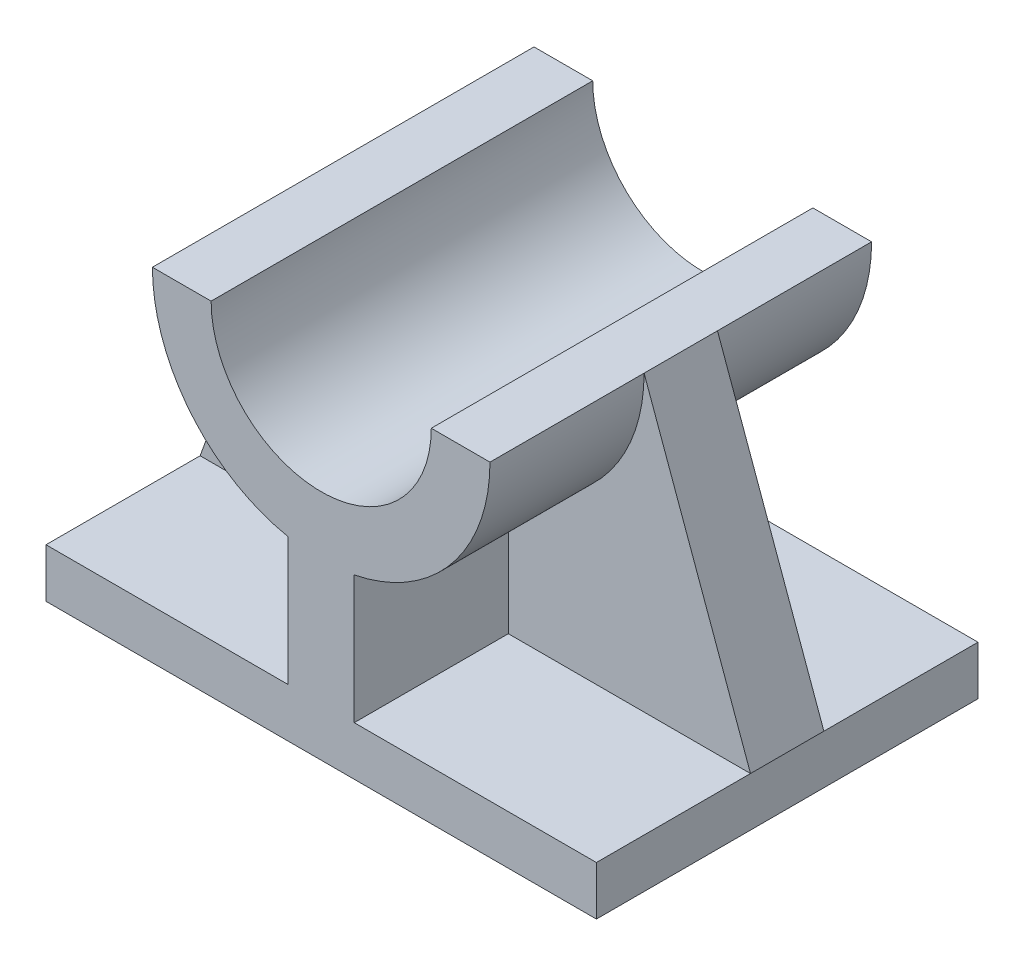
ISO-10303-21;
HEADER;
FILE_DESCRIPTION(('STEP AP214'),'2;1');
FILE_NAME('part.step','',(''),(''),'','','');
FILE_SCHEMA(('AUTOMOTIVE_DESIGN { 1 0 10303 214 1 1 1 1 }'));
ENDSEC;
DATA;
#1=APPLICATION_CONTEXT('core data for automotive mechanical design processes');
#2=APPLICATION_PROTOCOL_DEFINITION('international standard','automotive_design',2000,#1);
#3=PRODUCT_CONTEXT('',#1,'mechanical');
#4=PRODUCT('Part','Part','',(#3));
#5=PRODUCT_RELATED_PRODUCT_CATEGORY('part','',(#4));
#6=PRODUCT_DEFINITION_FORMATION('','',#4);
#7=PRODUCT_DEFINITION_CONTEXT('part definition',#1,'design');
#8=PRODUCT_DEFINITION('design','',#6,#7);
#9=PRODUCT_DEFINITION_SHAPE('','',#8);
#10=(LENGTH_UNIT() NAMED_UNIT(*) SI_UNIT(.MILLI.,.METRE.));
#11=(NAMED_UNIT(*) PLANE_ANGLE_UNIT() SI_UNIT($,.RADIAN.));
#12=(NAMED_UNIT(*) SI_UNIT($,.STERADIAN.) SOLID_ANGLE_UNIT());
#13=UNCERTAINTY_MEASURE_WITH_UNIT(LENGTH_MEASURE(1.E-05),#10,'distance_accuracy_value','');
#14=(GEOMETRIC_REPRESENTATION_CONTEXT(3) GLOBAL_UNCERTAINTY_ASSIGNED_CONTEXT((#13)) GLOBAL_UNIT_ASSIGNED_CONTEXT((#10,
#11,#12)) REPRESENTATION_CONTEXT('',''));
#15=CARTESIAN_POINT('',(0.,0.,0.));
#16=DIRECTION('',(0.,0.,1.));
#17=DIRECTION('',(1.,0.,0.));
#18=AXIS2_PLACEMENT_3D('',#15,#16,#17);
#19=CARTESIAN_POINT('',(37.5,46.6785714285714,26.));
#20=DIRECTION('',(0.,0.,-1.));
#21=DIRECTION('',(-1.,0.,0.));
#22=AXIS2_PLACEMENT_3D('',#19,#20,#21);
#23=CYLINDRICAL_SURFACE('',#22,23.);
#24=CARTESIAN_POINT('',(37.5,46.6785714285714,-5.));
#25=DIRECTION('',(0.,0.,1.));
#26=DIRECTION('',(1.,0.,0.));
#27=AXIS2_PLACEMENT_3D('',#24,#25,#26);
#28=CIRCLE('',#27,23.);
#29=CARTESIAN_POINT('',(14.5,46.6785714285714,-5.));
#30=VERTEX_POINT('',#29);
#31=CARTESIAN_POINT('',(33.,24.1230842912915,-5.));
#32=VERTEX_POINT('',#31);
#33=EDGE_CURVE('E472',#30,#32,#28,.T.);
#34=ORIENTED_EDGE('',*,*,#33,.F.);
#35=DIRECTION('',(0.,0.,-1.));
#36=VECTOR('',#35,1.);
#37=CARTESIAN_POINT('',(14.5,46.6785714285714,26.));
#38=LINE('',#37,#36);
#39=CARTESIAN_POINT('',(14.5,46.6785714285714,-26.));
#40=VERTEX_POINT('',#39);
#41=EDGE_CURVE('E206',#30,#40,#38,.T.);
#42=ORIENTED_EDGE('',*,*,#41,.T.);
#43=CARTESIAN_POINT('',(37.5,46.6785714285714,-26.));
#44=DIRECTION('',(0.,0.,1.));
#45=DIRECTION('',(1.,0.,0.));
#46=AXIS2_PLACEMENT_3D('',#43,#44,#45);
#47=CIRCLE('',#46,23.);
#48=CARTESIAN_POINT('',(33.,24.1230842912915,-26.));
#49=VERTEX_POINT('',#48);
#50=EDGE_CURVE('E272',#40,#49,#47,.T.);
#51=ORIENTED_EDGE('',*,*,#50,.T.);
#52=DIRECTION('',(0.,0.,-1.));
#53=VECTOR('',#52,1.);
#54=CARTESIAN_POINT('',(33.,24.1230842912915,26.));
#55=LINE('',#54,#53);
#56=EDGE_CURVE('E325',#32,#49,#55,.T.);
#57=ORIENTED_EDGE('',*,*,#56,.F.);
#58=EDGE_LOOP('',(#34,#42,#51,#57));
#59=FACE_BOUND('',#58,.T.);
#60=ADVANCED_FACE('F36',(#59),#23,.T.);
#61=CARTESIAN_POINT('',(33.,0.,26.));
#62=DIRECTION('',(-1.,0.,0.));
#63=DIRECTION('',(0.,0.,1.));
#64=AXIS2_PLACEMENT_3D('',#61,#62,#63);
#65=PLANE('',#64);
#66=DIRECTION('',(0.,0.,-1.));
#67=VECTOR('',#66,1.);
#68=CARTESIAN_POINT('',(33.,6.67857142857143,26.));
#69=LINE('',#68,#67);
#70=CARTESIAN_POINT('',(33.,6.67857142857143,-5.));
#71=VERTEX_POINT('',#70);
#72=CARTESIAN_POINT('',(33.,6.67857142857143,-26.));
#73=VERTEX_POINT('',#72);
#74=EDGE_CURVE('E321',#71,#73,#69,.T.);
#75=ORIENTED_EDGE('',*,*,#74,.F.);
#76=DIRECTION('',(0.,1.,0.));
#77=VECTOR('',#76,1.);
#78=CARTESIAN_POINT('',(33.,0.,-5.));
#79=LINE('',#78,#77);
#80=EDGE_CURVE('E196',#71,#32,#79,.T.);
#81=ORIENTED_EDGE('',*,*,#80,.T.);
#82=ORIENTED_EDGE('',*,*,#56,.T.);
#83=DIRECTION('',(0.,1.,0.));
#84=VECTOR('',#83,1.);
#85=CARTESIAN_POINT('',(33.,0.,-26.));
#86=LINE('',#85,#84);
#87=EDGE_CURVE('E276',#73,#49,#86,.T.);
#88=ORIENTED_EDGE('',*,*,#87,.F.);
#89=EDGE_LOOP('',(#75,#81,#82,#88));
#90=FACE_BOUND('',#89,.T.);
#91=ADVANCED_FACE('F340',(#90),#65,.T.);
#92=CARTESIAN_POINT('',(0.,6.67857142857143,26.));
#93=DIRECTION('',(0.,1.,0.));
#94=DIRECTION('',(0.,0.,1.));
#95=AXIS2_PLACEMENT_3D('',#92,#93,#94);
#96=PLANE('',#95);
#97=DIRECTION('',(0.,0.,-1.));
#98=VECTOR('',#97,1.);
#99=CARTESIAN_POINT('',(0.,6.67857142857143,26.));
#100=LINE('',#99,#98);
#101=CARTESIAN_POINT('',(0.,6.67857142857143,-4.99999999999999));
#102=VERTEX_POINT('',#101);
#103=CARTESIAN_POINT('',(0.,6.67857142857143,-26.));
#104=VERTEX_POINT('',#103);
#105=EDGE_CURVE('E317',#102,#104,#100,.T.);
#106=ORIENTED_EDGE('',*,*,#105,.F.);
#107=DIRECTION('',(1.,0.,0.));
#108=VECTOR('',#107,1.);
#109=CARTESIAN_POINT('',(0.,6.67857142857143,-5.));
#110=LINE('',#109,#108);
#111=EDGE_CURVE('E52',#102,#71,#110,.T.);
#112=ORIENTED_EDGE('',*,*,#111,.T.);
#113=ORIENTED_EDGE('',*,*,#74,.T.);
#114=DIRECTION('',(1.,0.,0.));
#115=VECTOR('',#114,1.);
#116=CARTESIAN_POINT('',(0.,6.67857142857143,-26.));
#117=LINE('',#116,#115);
#118=EDGE_CURVE('E280',#104,#73,#117,.T.);
#119=ORIENTED_EDGE('',*,*,#118,.F.);
#120=EDGE_LOOP('',(#106,#112,#113,#119));
#121=FACE_BOUND('',#120,.T.);
#122=ADVANCED_FACE('F337',(#121),#96,.T.);
#123=CARTESIAN_POINT('',(42.,0.,26.));
#124=DIRECTION('',(-1.,0.,0.));
#125=DIRECTION('',(0.,0.,1.));
#126=AXIS2_PLACEMENT_3D('',#123,#124,#125);
#127=PLANE('',#126);
#128=DIRECTION('',(0.,1.,0.));
#129=VECTOR('',#128,1.);
#130=CARTESIAN_POINT('',(42.,0.,-5.));
#131=LINE('',#130,#129);
#132=CARTESIAN_POINT('',(42.,6.67857142857143,-5.));
#133=VERTEX_POINT('',#132);
#134=CARTESIAN_POINT('',(42.,24.1230842912915,-5.));
#135=VERTEX_POINT('',#134);
#136=EDGE_CURVE('E449',#133,#135,#131,.T.);
#137=ORIENTED_EDGE('',*,*,#136,.F.);
#138=DIRECTION('',(0.,0.,-1.));
#139=VECTOR('',#138,1.);
#140=CARTESIAN_POINT('',(42.,6.67857142857143,26.));
#141=LINE('',#140,#139);
#142=CARTESIAN_POINT('',(42.,6.67857142857143,-26.));
#143=VERTEX_POINT('',#142);
#144=EDGE_CURVE('E305',#133,#143,#141,.T.);
#145=ORIENTED_EDGE('',*,*,#144,.T.);
#146=DIRECTION('',(0.,1.,0.));
#147=VECTOR('',#146,1.);
#148=CARTESIAN_POINT('',(42.,0.,-26.));
#149=LINE('',#148,#147);
#150=CARTESIAN_POINT('',(42.,24.1230842912915,-26.));
#151=VERTEX_POINT('',#150);
#152=EDGE_CURVE('E256',#143,#151,#149,.T.);
#153=ORIENTED_EDGE('',*,*,#152,.T.);
#154=DIRECTION('',(0.,0.,-1.));
#155=VECTOR('',#154,1.);
#156=CARTESIAN_POINT('',(42.,24.1230842912915,26.));
#157=LINE('',#156,#155);
#158=EDGE_CURVE('E45',#135,#151,#157,.T.);
#159=ORIENTED_EDGE('',*,*,#158,.F.);
#160=EDGE_LOOP('',(#137,#145,#153,#159));
#161=FACE_BOUND('',#160,.T.);
#162=ADVANCED_FACE('F540',(#161),#127,.F.);
#163=CARTESIAN_POINT('',(37.5,46.6785714285714,26.));
#164=DIRECTION('',(0.,0.,-1.));
#165=DIRECTION('',(-1.,0.,0.));
#166=AXIS2_PLACEMENT_3D('',#163,#164,#165);
#167=CYLINDRICAL_SURFACE('',#166,23.);
#168=CARTESIAN_POINT('',(37.5,46.6785714285714,-5.));
#169=DIRECTION('',(0.,0.,1.));
#170=DIRECTION('',(1.,0.,0.));
#171=AXIS2_PLACEMENT_3D('',#168,#169,#170);
#172=CIRCLE('',#171,23.);
#173=CARTESIAN_POINT('',(60.5,46.6785714285714,-5.));
#174=VERTEX_POINT('',#173);
#175=EDGE_CURVE('E208',#135,#174,#172,.T.);
#176=ORIENTED_EDGE('',*,*,#175,.F.);
#177=ORIENTED_EDGE('',*,*,#158,.T.);
#178=CARTESIAN_POINT('',(37.5,46.6785714285714,-26.));
#179=DIRECTION('',(0.,0.,1.));
#180=DIRECTION('',(1.,0.,0.));
#181=AXIS2_PLACEMENT_3D('',#178,#179,#180);
#182=CIRCLE('',#181,23.);
#183=CARTESIAN_POINT('',(60.5,46.6785714285714,-26.));
#184=VERTEX_POINT('',#183);
#185=EDGE_CURVE('E249',#151,#184,#182,.T.);
#186=ORIENTED_EDGE('',*,*,#185,.T.);
#187=DIRECTION('',(0.,0.,-1.));
#188=VECTOR('',#187,1.);
#189=CARTESIAN_POINT('',(60.5,46.6785714285714,26.));
#190=LINE('',#189,#188);
#191=EDGE_CURVE('E225',#174,#184,#190,.T.);
#192=ORIENTED_EDGE('',*,*,#191,.F.);
#193=EDGE_LOOP('',(#176,#177,#186,#192));
#194=FACE_BOUND('',#193,.T.);
#195=ADVANCED_FACE('F250',(#194),#167,.T.);
#196=CARTESIAN_POINT('',(0.,6.67857142857143,26.));
#197=DIRECTION('',(0.,1.,0.));
#198=DIRECTION('',(0.,0.,1.));
#199=AXIS2_PLACEMENT_3D('',#196,#197,#198);
#200=PLANE('',#199);
#201=ORIENTED_EDGE('',*,*,#144,.F.);
#202=DIRECTION('',(1.,0.,0.));
#203=VECTOR('',#202,1.);
#204=CARTESIAN_POINT('',(0.,6.67857142857143,-5.));
#205=LINE('',#204,#203);
#206=CARTESIAN_POINT('',(75.,6.67857142857143,-4.99999999999999));
#207=VERTEX_POINT('',#206);
#208=EDGE_CURVE('E446',#133,#207,#205,.T.);
#209=ORIENTED_EDGE('',*,*,#208,.T.);
#210=DIRECTION('',(0.,0.,-1.));
#211=VECTOR('',#210,1.);
#212=CARTESIAN_POINT('',(75.,6.67857142857143,26.));
#213=LINE('',#212,#211);
#214=CARTESIAN_POINT('',(75.,6.67857142857143,-26.));
#215=VERTEX_POINT('',#214);
#216=EDGE_CURVE('E304',#207,#215,#213,.T.);
#217=ORIENTED_EDGE('',*,*,#216,.T.);
#218=DIRECTION('',(1.,0.,0.));
#219=VECTOR('',#218,1.);
#220=CARTESIAN_POINT('',(0.,6.67857142857143,-26.));
#221=LINE('',#220,#219);
#222=EDGE_CURVE('E295',#143,#215,#221,.T.);
#223=ORIENTED_EDGE('',*,*,#222,.F.);
#224=EDGE_LOOP('',(#201,#209,#217,#223));
#225=FACE_BOUND('',#224,.T.);
#226=ADVANCED_FACE('F539',(#225),#200,.T.);
#227=CARTESIAN_POINT('',(42.,6.67857142857143,26.));
#228=VERTEX_POINT('',#227);
#229=CARTESIAN_POINT('',(42.,6.67857142857143,5.));
#230=VERTEX_POINT('',#229);
#231=EDGE_CURVE('E300',#228,#230,#141,.T.);
#232=ORIENTED_EDGE('',*,*,#231,.T.);
#233=DIRECTION('',(0.,1.,0.));
#234=VECTOR('',#233,1.);
#235=CARTESIAN_POINT('',(42.,0.,5.));
#236=LINE('',#235,#234);
#237=CARTESIAN_POINT('',(42.,24.1230842912915,5.));
#238=VERTEX_POINT('',#237);
#239=EDGE_CURVE('E456',#230,#238,#236,.T.);
#240=ORIENTED_EDGE('',*,*,#239,.T.);
#241=CARTESIAN_POINT('',(42.,24.1230842912915,26.));
#242=VERTEX_POINT('',#241);
#243=EDGE_CURVE('E11',#242,#238,#157,.T.);
#244=ORIENTED_EDGE('',*,*,#243,.F.);
#245=DIRECTION('',(0.,1.,0.));
#246=VECTOR('',#245,1.);
#247=CARTESIAN_POINT('',(42.,0.,26.));
#248=LINE('',#247,#246);
#249=EDGE_CURVE('E299',#228,#242,#248,.T.);
#250=ORIENTED_EDGE('',*,*,#249,.F.);
#251=EDGE_LOOP('',(#232,#240,#244,#250));
#252=FACE_BOUND('',#251,.T.);
#253=ADVANCED_FACE('F38',(#252),#127,.F.);
#254=ORIENTED_EDGE('',*,*,#243,.T.);
#255=CARTESIAN_POINT('',(37.5,46.6785714285714,5.));
#256=DIRECTION('',(0.,0.,1.));
#257=DIRECTION('',(1.,0.,0.));
#258=AXIS2_PLACEMENT_3D('',#255,#256,#257);
#259=CIRCLE('',#258,23.);
#260=CARTESIAN_POINT('',(60.5,46.6785714285714,5.));
#261=VERTEX_POINT('',#260);
#262=EDGE_CURVE('E445',#238,#261,#259,.T.);
#263=ORIENTED_EDGE('',*,*,#262,.T.);
#264=CARTESIAN_POINT('',(60.5,46.6785714285714,26.));
#265=VERTEX_POINT('',#264);
#266=EDGE_CURVE('E226',#265,#261,#190,.T.);
#267=ORIENTED_EDGE('',*,*,#266,.F.);
#268=CARTESIAN_POINT('',(37.5,46.6785714285714,26.));
#269=DIRECTION('',(0.,0.,1.));
#270=DIRECTION('',(1.,0.,0.));
#271=AXIS2_PLACEMENT_3D('',#268,#269,#270);
#272=CIRCLE('',#271,23.);
#273=EDGE_CURVE('E403',#242,#265,#272,.T.);
#274=ORIENTED_EDGE('',*,*,#273,.F.);
#275=EDGE_LOOP('',(#254,#263,#267,#274));
#276=FACE_BOUND('',#275,.T.);
#277=ADVANCED_FACE('F503',(#276),#167,.T.);
#278=CARTESIAN_POINT('',(0.,46.6785714285714,26.));
#279=DIRECTION('',(0.,-1.,0.));
#280=DIRECTION('',(0.,0.,-1.));
#281=AXIS2_PLACEMENT_3D('',#278,#279,#280);
#282=PLANE('',#281);
#283=DIRECTION('',(-1.,0.,0.));
#284=VECTOR('',#283,1.);
#285=CARTESIAN_POINT('',(0.,46.6785714285714,-26.));
#286=LINE('',#285,#284);
#287=CARTESIAN_POINT('',(52.5,46.6785714285714,-26.));
#288=VERTEX_POINT('',#287);
#289=EDGE_CURVE('E243',#184,#288,#286,.T.);
#290=ORIENTED_EDGE('',*,*,#289,.T.);
#291=DIRECTION('',(0.,0.,-1.));
#292=VECTOR('',#291,1.);
#293=CARTESIAN_POINT('',(52.5,46.6785714285714,26.));
#294=LINE('',#293,#292);
#295=CARTESIAN_POINT('',(52.5,46.6785714285714,26.));
#296=VERTEX_POINT('',#295);
#297=EDGE_CURVE('E218',#296,#288,#294,.T.);
#298=ORIENTED_EDGE('',*,*,#297,.F.);
#299=DIRECTION('',(-1.,0.,0.));
#300=VECTOR('',#299,1.);
#301=CARTESIAN_POINT('',(0.,46.6785714285714,26.));
#302=LINE('',#301,#300);
#303=EDGE_CURVE('E399',#265,#296,#302,.T.);
#304=ORIENTED_EDGE('',*,*,#303,.F.);
#305=ORIENTED_EDGE('',*,*,#266,.T.);
#306=DIRECTION('',(0.,0.,-1.));
#307=VECTOR('',#306,1.);
#308=CARTESIAN_POINT('',(60.5,46.6785714285714,5.));
#309=LINE('',#308,#307);
#310=EDGE_CURVE('E245',#261,#174,#309,.T.);
#311=ORIENTED_EDGE('',*,*,#310,.T.);
#312=ORIENTED_EDGE('',*,*,#191,.T.);
#313=EDGE_LOOP('',(#290,#298,#304,#305,#311,#312));
#314=FACE_BOUND('',#313,.T.);
#315=ADVANCED_FACE('F240',(#314),#282,.F.);
#316=CARTESIAN_POINT('',(37.5,46.6785714285714,26.));
#317=DIRECTION('',(0.,0.,-1.));
#318=DIRECTION('',(-1.,0.,0.));
#319=AXIS2_PLACEMENT_3D('',#316,#317,#318);
#320=CYLINDRICAL_SURFACE('',#319,15.);
#321=CARTESIAN_POINT('',(37.5,46.6785714285714,-26.));
#322=DIRECTION('',(0.,0.,1.));
#323=DIRECTION('',(1.,0.,0.));
#324=AXIS2_PLACEMENT_3D('',#321,#322,#323);
#325=CIRCLE('',#324,15.);
#326=CARTESIAN_POINT('',(22.5,46.6785714285714,-26.));
#327=VERTEX_POINT('',#326);
#328=EDGE_CURVE('E261',#327,#288,#325,.T.);
#329=ORIENTED_EDGE('',*,*,#328,.F.);
#330=DIRECTION('',(0.,0.,-1.));
#331=VECTOR('',#330,1.);
#332=CARTESIAN_POINT('',(22.5,46.6785714285714,26.));
#333=LINE('',#332,#331);
#334=CARTESIAN_POINT('',(22.5,46.6785714285714,26.));
#335=VERTEX_POINT('',#334);
#336=EDGE_CURVE('E213',#335,#327,#333,.T.);
#337=ORIENTED_EDGE('',*,*,#336,.F.);
#338=CARTESIAN_POINT('',(37.5,46.6785714285714,26.));
#339=DIRECTION('',(0.,0.,1.));
#340=DIRECTION('',(1.,0.,0.));
#341=AXIS2_PLACEMENT_3D('',#338,#339,#340);
#342=CIRCLE('',#341,15.);
#343=EDGE_CURVE('E394',#335,#296,#342,.T.);
#344=ORIENTED_EDGE('',*,*,#343,.T.);
#345=ORIENTED_EDGE('',*,*,#297,.T.);
#346=EDGE_LOOP('',(#329,#337,#344,#345));
#347=FACE_BOUND('',#346,.T.);
#348=ADVANCED_FACE('F506',(#347),#320,.F.);
#349=CARTESIAN_POINT('',(0.,46.6785714285714,26.));
#350=DIRECTION('',(0.,-1.,0.));
#351=DIRECTION('',(0.,0.,-1.));
#352=AXIS2_PLACEMENT_3D('',#349,#350,#351);
#353=PLANE('',#352);
#354=DIRECTION('',(-1.,0.,0.));
#355=VECTOR('',#354,1.);
#356=CARTESIAN_POINT('',(0.,46.6785714285714,-26.));
#357=LINE('',#356,#355);
#358=EDGE_CURVE('E266',#327,#40,#357,.T.);
#359=ORIENTED_EDGE('',*,*,#358,.T.);
#360=ORIENTED_EDGE('',*,*,#41,.F.);
#361=DIRECTION('',(0.,0.,-1.));
#362=VECTOR('',#361,1.);
#363=CARTESIAN_POINT('',(14.5,46.6785714285714,5.));
#364=LINE('',#363,#362);
#365=CARTESIAN_POINT('',(14.5,46.6785714285714,5.));
#366=VERTEX_POINT('',#365);
#367=EDGE_CURVE('E178',#366,#30,#364,.T.);
#368=ORIENTED_EDGE('',*,*,#367,.F.);
#369=CARTESIAN_POINT('',(14.5,46.6785714285714,26.));
#370=VERTEX_POINT('',#369);
#371=EDGE_CURVE('E204',#370,#366,#38,.T.);
#372=ORIENTED_EDGE('',*,*,#371,.F.);
#373=DIRECTION('',(-1.,0.,0.));
#374=VECTOR('',#373,1.);
#375=CARTESIAN_POINT('',(0.,46.6785714285714,26.));
#376=LINE('',#375,#374);
#377=EDGE_CURVE('E390',#335,#370,#376,.T.);
#378=ORIENTED_EDGE('',*,*,#377,.F.);
#379=ORIENTED_EDGE('',*,*,#336,.T.);
#380=EDGE_LOOP('',(#359,#360,#368,#372,#378,#379));
#381=FACE_BOUND('',#380,.T.);
#382=ADVANCED_FACE('F202',(#381),#353,.F.);
#383=ORIENTED_EDGE('',*,*,#371,.T.);
#384=CARTESIAN_POINT('',(37.5,46.6785714285714,5.));
#385=DIRECTION('',(0.,0.,1.));
#386=DIRECTION('',(1.,0.,0.));
#387=AXIS2_PLACEMENT_3D('',#384,#385,#386);
#388=CIRCLE('',#387,23.);
#389=CARTESIAN_POINT('',(33.,24.1230842912915,5.));
#390=VERTEX_POINT('',#389);
#391=EDGE_CURVE('E185',#366,#390,#388,.T.);
#392=ORIENTED_EDGE('',*,*,#391,.T.);
#393=CARTESIAN_POINT('',(33.,24.1230842912915,26.));
#394=VERTEX_POINT('',#393);
#395=EDGE_CURVE('E220',#394,#390,#55,.T.);
#396=ORIENTED_EDGE('',*,*,#395,.F.);
#397=CARTESIAN_POINT('',(37.5,46.6785714285714,26.));
#398=DIRECTION('',(0.,0.,1.));
#399=DIRECTION('',(1.,0.,0.));
#400=AXIS2_PLACEMENT_3D('',#397,#398,#399);
#401=CIRCLE('',#400,23.);
#402=EDGE_CURVE('E211',#370,#394,#401,.T.);
#403=ORIENTED_EDGE('',*,*,#402,.F.);
#404=EDGE_LOOP('',(#383,#392,#396,#403));
#405=FACE_BOUND('',#404,.T.);
#406=ADVANCED_FACE('F210',(#405),#23,.T.);
#407=DIRECTION('',(0.,1.,0.));
#408=VECTOR('',#407,1.);
#409=CARTESIAN_POINT('',(33.,0.,5.));
#410=LINE('',#409,#408);
#411=CARTESIAN_POINT('',(33.,6.67857142857143,5.));
#412=VERTEX_POINT('',#411);
#413=EDGE_CURVE('E190',#412,#390,#410,.T.);
#414=ORIENTED_EDGE('',*,*,#413,.F.);
#415=CARTESIAN_POINT('',(33.,6.67857142857143,26.));
#416=VERTEX_POINT('',#415);
#417=EDGE_CURVE('E322',#416,#412,#69,.T.);
#418=ORIENTED_EDGE('',*,*,#417,.F.);
#419=DIRECTION('',(0.,1.,0.));
#420=VECTOR('',#419,1.);
#421=CARTESIAN_POINT('',(33.,0.,26.));
#422=LINE('',#421,#420);
#423=EDGE_CURVE('E382',#416,#394,#422,.T.);
#424=ORIENTED_EDGE('',*,*,#423,.T.);
#425=ORIENTED_EDGE('',*,*,#395,.T.);
#426=EDGE_LOOP('',(#414,#418,#424,#425));
#427=FACE_BOUND('',#426,.T.);
#428=ADVANCED_FACE('F480',(#427),#65,.T.);
#429=DIRECTION('',(1.,0.,0.));
#430=VECTOR('',#429,1.);
#431=CARTESIAN_POINT('',(0.,6.67857142857143,5.));
#432=LINE('',#431,#430);
#433=CARTESIAN_POINT('',(0.,6.67857142857143,5.));
#434=VERTEX_POINT('',#433);
#435=EDGE_CURVE('E184',#434,#412,#432,.T.);
#436=ORIENTED_EDGE('',*,*,#435,.F.);
#437=CARTESIAN_POINT('',(0.,6.67857142857143,26.));
#438=VERTEX_POINT('',#437);
#439=EDGE_CURVE('E318',#438,#434,#100,.T.);
#440=ORIENTED_EDGE('',*,*,#439,.F.);
#441=DIRECTION('',(1.,0.,0.));
#442=VECTOR('',#441,1.);
#443=CARTESIAN_POINT('',(0.,6.67857142857143,26.));
#444=LINE('',#443,#442);
#445=EDGE_CURVE('E378',#438,#416,#444,.T.);
#446=ORIENTED_EDGE('',*,*,#445,.T.);
#447=ORIENTED_EDGE('',*,*,#417,.T.);
#448=EDGE_LOOP('',(#436,#440,#446,#447));
#449=FACE_BOUND('',#448,.T.);
#450=ADVANCED_FACE('F489',(#449),#96,.T.);
#451=CARTESIAN_POINT('',(0.,0.,26.));
#452=DIRECTION('',(-1.,0.,0.));
#453=DIRECTION('',(0.,0.,1.));
#454=AXIS2_PLACEMENT_3D('',#451,#452,#453);
#455=PLANE('',#454);
#456=DIRECTION('',(0.,1.,0.));
#457=VECTOR('',#456,1.);
#458=CARTESIAN_POINT('',(0.,0.,-26.));
#459=LINE('',#458,#457);
#460=CARTESIAN_POINT('',(0.,0.,-26.));
#461=VERTEX_POINT('',#460);
#462=EDGE_CURVE('E284',#461,#104,#459,.T.);
#463=ORIENTED_EDGE('',*,*,#462,.F.);
#464=DIRECTION('',(0.,0.,-1.));
#465=VECTOR('',#464,1.);
#466=CARTESIAN_POINT('',(0.,0.,26.));
#467=LINE('',#466,#465);
#468=CARTESIAN_POINT('',(0.,0.,26.));
#469=VERTEX_POINT('',#468);
#470=EDGE_CURVE('E314',#469,#461,#467,.T.);
#471=ORIENTED_EDGE('',*,*,#470,.F.);
#472=DIRECTION('',(0.,1.,0.));
#473=VECTOR('',#472,1.);
#474=CARTESIAN_POINT('',(0.,0.,26.));
#475=LINE('',#474,#473);
#476=EDGE_CURVE('E374',#469,#438,#475,.T.);
#477=ORIENTED_EDGE('',*,*,#476,.T.);
#478=ORIENTED_EDGE('',*,*,#439,.T.);
#479=DIRECTION('',(0.,0.,-1.));
#480=VECTOR('',#479,1.);
#481=CARTESIAN_POINT('',(0.,6.67857142857143,5.));
#482=LINE('',#481,#480);
#483=EDGE_CURVE('E180',#434,#102,#482,.T.);
#484=ORIENTED_EDGE('',*,*,#483,.T.);
#485=ORIENTED_EDGE('',*,*,#105,.T.);
#486=EDGE_LOOP('',(#463,#471,#477,#478,#484,#485));
#487=FACE_BOUND('',#486,.T.);
#488=ADVANCED_FACE('F347',(#487),#455,.T.);
#489=CARTESIAN_POINT('',(0.,0.,26.));
#490=DIRECTION('',(0.,1.,0.));
#491=DIRECTION('',(0.,0.,1.));
#492=AXIS2_PLACEMENT_3D('',#489,#490,#491);
#493=PLANE('',#492);
#494=DIRECTION('',(1.,0.,0.));
#495=VECTOR('',#494,1.);
#496=CARTESIAN_POINT('',(0.,0.,-26.));
#497=LINE('',#496,#495);
#498=CARTESIAN_POINT('',(75.,0.,-26.));
#499=VERTEX_POINT('',#498);
#500=EDGE_CURVE('E288',#461,#499,#497,.T.);
#501=ORIENTED_EDGE('',*,*,#500,.T.);
#502=DIRECTION('',(0.,0.,-1.));
#503=VECTOR('',#502,1.);
#504=CARTESIAN_POINT('',(75.,0.,26.));
#505=LINE('',#504,#503);
#506=CARTESIAN_POINT('',(75.,0.,26.));
#507=VERTEX_POINT('',#506);
#508=EDGE_CURVE('E310',#507,#499,#505,.T.);
#509=ORIENTED_EDGE('',*,*,#508,.F.);
#510=DIRECTION('',(1.,0.,0.));
#511=VECTOR('',#510,1.);
#512=CARTESIAN_POINT('',(0.,0.,26.));
#513=LINE('',#512,#511);
#514=EDGE_CURVE('E370',#469,#507,#513,.T.);
#515=ORIENTED_EDGE('',*,*,#514,.F.);
#516=ORIENTED_EDGE('',*,*,#470,.T.);
#517=EDGE_LOOP('',(#501,#509,#515,#516));
#518=FACE_BOUND('',#517,.T.);
#519=ADVANCED_FACE('F494',(#518),#493,.F.);
#520=CARTESIAN_POINT('',(75.,0.,26.));
#521=DIRECTION('',(-1.,0.,0.));
#522=DIRECTION('',(0.,0.,1.));
#523=AXIS2_PLACEMENT_3D('',#520,#521,#522);
#524=PLANE('',#523);
#525=DIRECTION('',(0.,1.,0.));
#526=VECTOR('',#525,1.);
#527=CARTESIAN_POINT('',(75.,0.,-26.));
#528=LINE('',#527,#526);
#529=EDGE_CURVE('E291',#499,#215,#528,.T.);
#530=ORIENTED_EDGE('',*,*,#529,.T.);
#531=ORIENTED_EDGE('',*,*,#216,.F.);
#532=DIRECTION('',(0.,0.,-1.));
#533=VECTOR('',#532,1.);
#534=CARTESIAN_POINT('',(75.,6.67857142857143,5.));
#535=LINE('',#534,#533);
#536=CARTESIAN_POINT('',(75.,6.67857142857143,5.));
#537=VERTEX_POINT('',#536);
#538=EDGE_CURVE('E425',#537,#207,#535,.T.);
#539=ORIENTED_EDGE('',*,*,#538,.F.);
#540=CARTESIAN_POINT('',(75.,6.67857142857143,26.));
#541=VERTEX_POINT('',#540);
#542=EDGE_CURVE('E306',#541,#537,#213,.T.);
#543=ORIENTED_EDGE('',*,*,#542,.F.);
#544=DIRECTION('',(0.,1.,0.));
#545=VECTOR('',#544,1.);
#546=CARTESIAN_POINT('',(75.,0.,26.));
#547=LINE('',#546,#545);
#548=EDGE_CURVE('E366',#507,#541,#547,.T.);
#549=ORIENTED_EDGE('',*,*,#548,.F.);
#550=ORIENTED_EDGE('',*,*,#508,.T.);
#551=EDGE_LOOP('',(#530,#531,#539,#543,#549,#550));
#552=FACE_BOUND('',#551,.T.);
#553=ADVANCED_FACE('F496',(#552),#524,.F.);
#554=DIRECTION('',(1.,0.,0.));
#555=VECTOR('',#554,1.);
#556=CARTESIAN_POINT('',(0.,6.67857142857143,5.));
#557=LINE('',#556,#555);
#558=EDGE_CURVE('E440',#230,#537,#557,.T.);
#559=ORIENTED_EDGE('',*,*,#558,.F.);
#560=ORIENTED_EDGE('',*,*,#231,.F.);
#561=DIRECTION('',(1.,0.,0.));
#562=VECTOR('',#561,1.);
#563=CARTESIAN_POINT('',(0.,6.67857142857143,26.));
#564=LINE('',#563,#562);
#565=EDGE_CURVE('E362',#228,#541,#564,.T.);
#566=ORIENTED_EDGE('',*,*,#565,.T.);
#567=ORIENTED_EDGE('',*,*,#542,.T.);
#568=EDGE_LOOP('',(#559,#560,#566,#567));
#569=FACE_BOUND('',#568,.T.);
#570=ADVANCED_FACE('F500',(#569),#200,.T.);
#571=CARTESIAN_POINT('',(0.,0.,26.));
#572=DIRECTION('',(0.,0.,1.));
#573=DIRECTION('',(1.,0.,0.));
#574=AXIS2_PLACEMENT_3D('',#571,#572,#573);
#575=PLANE('',#574);
#576=ORIENTED_EDGE('',*,*,#249,.T.);
#577=ORIENTED_EDGE('',*,*,#273,.T.);
#578=ORIENTED_EDGE('',*,*,#303,.T.);
#579=ORIENTED_EDGE('',*,*,#343,.F.);
#580=ORIENTED_EDGE('',*,*,#377,.T.);
#581=ORIENTED_EDGE('',*,*,#402,.T.);
#582=ORIENTED_EDGE('',*,*,#423,.F.);
#583=ORIENTED_EDGE('',*,*,#445,.F.);
#584=ORIENTED_EDGE('',*,*,#476,.F.);
#585=ORIENTED_EDGE('',*,*,#514,.T.);
#586=ORIENTED_EDGE('',*,*,#548,.T.);
#587=ORIENTED_EDGE('',*,*,#565,.F.);
#588=EDGE_LOOP('',(#576,#577,#578,#579,#580,#581,#582,#583,#584,#585,#586,#587));
#589=FACE_BOUND('',#588,.T.);
#590=ADVANCED_FACE('F487',(#589),#575,.T.);
#591=CARTESIAN_POINT('',(0.,0.,-26.));
#592=DIRECTION('',(0.,0.,1.));
#593=DIRECTION('',(1.,0.,0.));
#594=AXIS2_PLACEMENT_3D('',#591,#592,#593);
#595=PLANE('',#594);
#596=ORIENTED_EDGE('',*,*,#152,.F.);
#597=ORIENTED_EDGE('',*,*,#222,.T.);
#598=ORIENTED_EDGE('',*,*,#529,.F.);
#599=ORIENTED_EDGE('',*,*,#500,.F.);
#600=ORIENTED_EDGE('',*,*,#462,.T.);
#601=ORIENTED_EDGE('',*,*,#118,.T.);
#602=ORIENTED_EDGE('',*,*,#87,.T.);
#603=ORIENTED_EDGE('',*,*,#50,.F.);
#604=ORIENTED_EDGE('',*,*,#358,.F.);
#605=ORIENTED_EDGE('',*,*,#328,.T.);
#606=ORIENTED_EDGE('',*,*,#289,.F.);
#607=ORIENTED_EDGE('',*,*,#185,.F.);
#608=EDGE_LOOP('',(#596,#597,#598,#599,#600,#601,#602,#603,#604,#605,#606,#607));
#609=FACE_BOUND('',#608,.T.);
#610=ADVANCED_FACE('F258',(#609),#595,.F.);
#611=CARTESIAN_POINT('',(68.4289857359876,24.8055073292955,5.));
#612=DIRECTION('',(0.940136065162483,0.3407993236214,0.));
#613=DIRECTION('',(-0.3407993236214,0.940136065162483,0.));
#614=AXIS2_PLACEMENT_3D('',#611,#612,#613);
#615=PLANE('',#614);
#616=DIRECTION('',(0.3407993236214,-0.940136065162483,0.));
#617=VECTOR('',#616,1.);
#618=CARTESIAN_POINT('',(68.4289857359876,24.8055073292955,-5.));
#619=LINE('',#618,#617);
#620=EDGE_CURVE('E60',#174,#207,#619,.T.);
#621=ORIENTED_EDGE('',*,*,#620,.F.);
#622=ORIENTED_EDGE('',*,*,#310,.F.);
#623=DIRECTION('',(0.3407993236214,-0.940136065162483,0.));
#624=VECTOR('',#623,1.);
#625=CARTESIAN_POINT('',(68.4289857359876,24.8055073292955,5.));
#626=LINE('',#625,#624);
#627=EDGE_CURVE('E437',#261,#537,#626,.T.);
#628=ORIENTED_EDGE('',*,*,#627,.T.);
#629=ORIENTED_EDGE('',*,*,#538,.T.);
#630=EDGE_LOOP('',(#621,#622,#628,#629));
#631=FACE_BOUND('',#630,.T.);
#632=ADVANCED_FACE('F563',(#631),#615,.T.);
#633=CARTESIAN_POINT('',(0.,0.,5.));
#634=DIRECTION('',(0.,0.,1.));
#635=DIRECTION('',(1.,0.,0.));
#636=AXIS2_PLACEMENT_3D('',#633,#634,#635);
#637=PLANE('',#636);
#638=ORIENTED_EDGE('',*,*,#262,.F.);
#639=ORIENTED_EDGE('',*,*,#239,.F.);
#640=ORIENTED_EDGE('',*,*,#558,.T.);
#641=ORIENTED_EDGE('',*,*,#627,.F.);
#642=EDGE_LOOP('',(#638,#639,#640,#641));
#643=FACE_BOUND('',#642,.T.);
#644=ADVANCED_FACE('F557',(#643),#637,.T.);
#645=CARTESIAN_POINT('',(0.,0.,-5.));
#646=DIRECTION('',(0.,0.,1.));
#647=DIRECTION('',(1.,0.,0.));
#648=AXIS2_PLACEMENT_3D('',#645,#646,#647);
#649=PLANE('',#648);
#650=ORIENTED_EDGE('',*,*,#175,.T.);
#651=ORIENTED_EDGE('',*,*,#620,.T.);
#652=ORIENTED_EDGE('',*,*,#208,.F.);
#653=ORIENTED_EDGE('',*,*,#136,.T.);
#654=EDGE_LOOP('',(#650,#651,#652,#653));
#655=FACE_BOUND('',#654,.T.);
#656=ADVANCED_FACE('F555',(#655),#649,.F.);
#657=CARTESIAN_POINT('',(-2.13979915954781,0.775677195336081,5.));
#658=DIRECTION('',(0.940136065162483,-0.3407993236214,0.));
#659=DIRECTION('',(0.3407993236214,0.940136065162483,0.));
#660=AXIS2_PLACEMENT_3D('',#657,#658,#659);
#661=PLANE('',#660);
#662=DIRECTION('',(-0.3407993236214,-0.940136065162483,0.));
#663=VECTOR('',#662,1.);
#664=CARTESIAN_POINT('',(-2.13979915954781,0.775677195336081,-5.));
#665=LINE('',#664,#663);
#666=EDGE_CURVE('E469',#30,#102,#665,.T.);
#667=ORIENTED_EDGE('',*,*,#666,.T.);
#668=ORIENTED_EDGE('',*,*,#483,.F.);
#669=DIRECTION('',(-0.3407993236214,-0.940136065162483,0.));
#670=VECTOR('',#669,1.);
#671=CARTESIAN_POINT('',(-2.13979915954781,0.775677195336081,5.));
#672=LINE('',#671,#670);
#673=EDGE_CURVE('E174',#366,#434,#672,.T.);
#674=ORIENTED_EDGE('',*,*,#673,.F.);
#675=ORIENTED_EDGE('',*,*,#367,.T.);
#676=EDGE_LOOP('',(#667,#668,#674,#675));
#677=FACE_BOUND('',#676,.T.);
#678=ADVANCED_FACE('F176',(#677),#661,.F.);
#679=CARTESIAN_POINT('',(0.,0.,5.));
#680=DIRECTION('',(0.,0.,1.));
#681=DIRECTION('',(1.,0.,0.));
#682=AXIS2_PLACEMENT_3D('',#679,#680,#681);
#683=PLANE('',#682);
#684=ORIENTED_EDGE('',*,*,#391,.F.);
#685=ORIENTED_EDGE('',*,*,#673,.T.);
#686=ORIENTED_EDGE('',*,*,#435,.T.);
#687=ORIENTED_EDGE('',*,*,#413,.T.);
#688=EDGE_LOOP('',(#684,#685,#686,#687));
#689=FACE_BOUND('',#688,.T.);
#690=ADVANCED_FACE('F188',(#689),#683,.T.);
#691=CARTESIAN_POINT('',(0.,0.,-5.));
#692=DIRECTION('',(0.,0.,1.));
#693=DIRECTION('',(1.,0.,0.));
#694=AXIS2_PLACEMENT_3D('',#691,#692,#693);
#695=PLANE('',#694);
#696=ORIENTED_EDGE('',*,*,#33,.T.);
#697=ORIENTED_EDGE('',*,*,#80,.F.);
#698=ORIENTED_EDGE('',*,*,#111,.F.);
#699=ORIENTED_EDGE('',*,*,#666,.F.);
#700=EDGE_LOOP('',(#696,#697,#698,#699));
#701=FACE_BOUND('',#700,.T.);
#702=ADVANCED_FACE('F509',(#701),#695,.F.);
#703=CLOSED_SHELL('',(#60,#91,#122,#162,#195,#226,#253,#277,#315,#348,#382,#406,#428,#450,#488,
#519,#553,#570,#590,#610,#632,#644,#656,#678,#690,#702));
#704=MANIFOLD_SOLID_BREP('B2',#703);
#705=ADVANCED_BREP_SHAPE_REPRESENTATION('',(#18,#704),#14);
#706=SHAPE_DEFINITION_REPRESENTATION(#9,#705);
ENDSEC;
END-ISO-10303-21;
